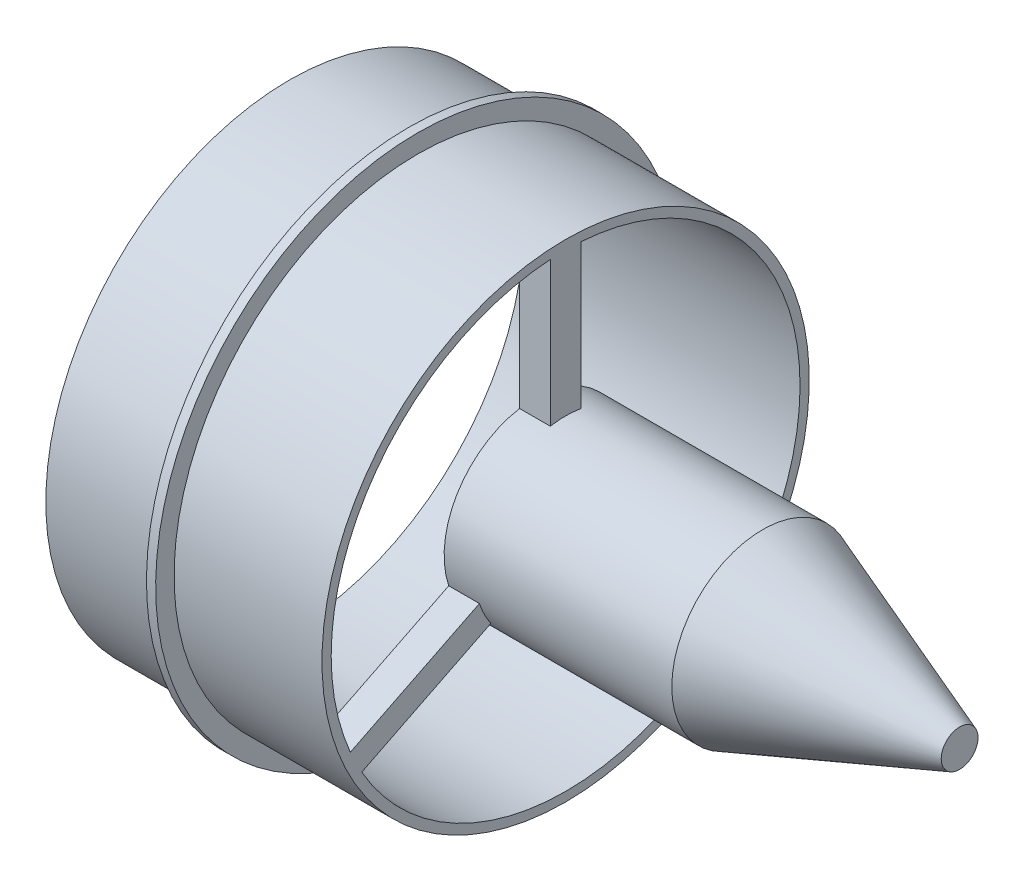
ISO-10303-21;
HEADER;
FILE_DESCRIPTION(('STEP AP214'),'2;1');
FILE_NAME('part.step','',(''),(''),'','','');
FILE_SCHEMA(('AUTOMOTIVE_DESIGN { 1 0 10303 214 1 1 1 1 }'));
ENDSEC;
DATA;
#1=APPLICATION_CONTEXT('core data for automotive mechanical design processes');
#2=APPLICATION_PROTOCOL_DEFINITION('international standard','automotive_design',2000,#1);
#3=PRODUCT_CONTEXT('',#1,'mechanical');
#4=PRODUCT('Part','Part','',(#3));
#5=PRODUCT_RELATED_PRODUCT_CATEGORY('part','',(#4));
#6=PRODUCT_DEFINITION_FORMATION('','',#4);
#7=PRODUCT_DEFINITION_CONTEXT('part definition',#1,'design');
#8=PRODUCT_DEFINITION('design','',#6,#7);
#9=PRODUCT_DEFINITION_SHAPE('','',#8);
#10=(LENGTH_UNIT() NAMED_UNIT(*) SI_UNIT(.MILLI.,.METRE.));
#11=(NAMED_UNIT(*) PLANE_ANGLE_UNIT() SI_UNIT($,.RADIAN.));
#12=(NAMED_UNIT(*) SI_UNIT($,.STERADIAN.) SOLID_ANGLE_UNIT());
#13=UNCERTAINTY_MEASURE_WITH_UNIT(LENGTH_MEASURE(1.E-05),#10,'distance_accuracy_value','');
#14=(GEOMETRIC_REPRESENTATION_CONTEXT(3) GLOBAL_UNCERTAINTY_ASSIGNED_CONTEXT((#13)) GLOBAL_UNIT_ASSIGNED_CONTEXT((#10,
#11,#12)) REPRESENTATION_CONTEXT('',''));
#15=CARTESIAN_POINT('',(0.,0.,0.));
#16=DIRECTION('',(0.,0.,1.));
#17=DIRECTION('',(1.,0.,0.));
#18=AXIS2_PLACEMENT_3D('',#15,#16,#17);
#19=CARTESIAN_POINT('',(45.,0.,0.));
#20=DIRECTION('',(-1.,0.,0.));
#21=DIRECTION('',(0.,0.,1.));
#22=AXIS2_PLACEMENT_3D('',#19,#20,#21);
#23=CYLINDRICAL_SURFACE('',#22,39.7);
#24=CARTESIAN_POINT('',(0.,0.,0.));
#25=DIRECTION('',(1.,0.,0.));
#26=DIRECTION('',(0.,1.,0.));
#27=AXIS2_PLACEMENT_3D('',#24,#25,#26);
#28=CIRCLE('',#27,39.7);
#29=CARTESIAN_POINT('',(0.,39.7,0.));
#30=VERTEX_POINT('',#29);
#31=EDGE_CURVE('E10',#30,#30,#28,.T.);
#32=ORIENTED_EDGE('',*,*,#31,.T.);
#33=EDGE_LOOP('',(#32));
#34=FACE_BOUND('',#33,.T.);
#35=CARTESIAN_POINT('',(19.4,0.,0.));
#36=DIRECTION('',(1.,0.,0.));
#37=DIRECTION('',(0.,1.,0.));
#38=AXIS2_PLACEMENT_3D('',#35,#36,#37);
#39=CIRCLE('',#38,39.7);
#40=CARTESIAN_POINT('',(19.4,39.7,0.));
#41=VERTEX_POINT('',#40);
#42=EDGE_CURVE('E212',#41,#41,#39,.T.);
#43=ORIENTED_EDGE('',*,*,#42,.F.);
#44=EDGE_LOOP('',(#43));
#45=FACE_BOUND('',#44,.T.);
#46=ADVANCED_FACE('F16',(#34,#45),#23,.T.);
#47=CARTESIAN_POINT('',(45.,0.,0.));
#48=DIRECTION('',(-1.,0.,0.));
#49=DIRECTION('',(0.,0.,1.));
#50=AXIS2_PLACEMENT_3D('',#47,#48,#49);
#51=CYLINDRICAL_SURFACE('',#50,39.7);
#52=CARTESIAN_POINT('',(20.9,0.,0.));
#53=DIRECTION('',(1.,0.,0.));
#54=DIRECTION('',(0.,1.,0.));
#55=AXIS2_PLACEMENT_3D('',#52,#53,#54);
#56=CIRCLE('',#55,39.7);
#57=CARTESIAN_POINT('',(20.9,39.7,0.));
#58=VERTEX_POINT('',#57);
#59=EDGE_CURVE('E26',#58,#58,#56,.T.);
#60=ORIENTED_EDGE('',*,*,#59,.T.);
#61=EDGE_LOOP('',(#60));
#62=FACE_BOUND('',#61,.T.);
#63=CARTESIAN_POINT('',(45.,0.,0.));
#64=DIRECTION('',(1.,0.,0.));
#65=DIRECTION('',(0.,1.,0.));
#66=AXIS2_PLACEMENT_3D('',#63,#64,#65);
#67=CIRCLE('',#66,39.7);
#68=CARTESIAN_POINT('',(45.,39.7,0.));
#69=VERTEX_POINT('',#68);
#70=EDGE_CURVE('E246',#69,#69,#67,.T.);
#71=ORIENTED_EDGE('',*,*,#70,.F.);
#72=EDGE_LOOP('',(#71));
#73=FACE_BOUND('',#72,.T.);
#74=ADVANCED_FACE('F260',(#62,#73),#51,.T.);
#75=CARTESIAN_POINT('',(45.,0.,0.));
#76=DIRECTION('',(1.,0.,0.));
#77=DIRECTION('',(0.,0.,-1.));
#78=AXIS2_PLACEMENT_3D('',#75,#76,#77);
#79=PLANE('',#78);
#80=ORIENTED_EDGE('',*,*,#70,.T.);
#81=EDGE_LOOP('',(#80));
#82=FACE_BOUND('',#81,.T.);
#83=CARTESIAN_POINT('',(45.,0.,0.));
#84=DIRECTION('',(1.,0.,0.));
#85=DIRECTION('',(0.,1.,0.));
#86=AXIS2_PLACEMENT_3D('',#83,#84,#85);
#87=CIRCLE('',#86,14.8);
#88=CARTESIAN_POINT('',(45.,14.5873232637109,-2.5));
#89=VERTEX_POINT('',#88);
#90=CARTESIAN_POINT('',(45.,14.5873232637109,2.5));
#91=VERTEX_POINT('',#90);
#92=EDGE_CURVE('E35',#89,#91,#87,.T.);
#93=ORIENTED_EDGE('',*,*,#92,.F.);
#94=DIRECTION('',(0.,1.,0.));
#95=VECTOR('',#94,1.);
#96=CARTESIAN_POINT('',(45.,14.5873232637109,-2.5));
#97=LINE('',#96,#95);
#98=CARTESIAN_POINT('',(45.,38.1181059340571,-2.5));
#99=VERTEX_POINT('',#98);
#100=EDGE_CURVE('E240',#89,#99,#97,.T.);
#101=ORIENTED_EDGE('',*,*,#100,.T.);
#102=CARTESIAN_POINT('',(45.,0.,0.));
#103=DIRECTION('',(-1.,0.,0.));
#104=DIRECTION('',(0.,0.,1.));
#105=AXIS2_PLACEMENT_3D('',#102,#103,#104);
#106=CIRCLE('',#105,38.2);
#107=CARTESIAN_POINT('',(45.,-15.1312278528921,-35.0754321949689));
#108=VERTEX_POINT('',#107);
#109=EDGE_CURVE('E245',#99,#108,#106,.T.);
#110=ORIENTED_EDGE('',*,*,#109,.T.);
#111=DIRECTION('',(0.,0.445659530203826,0.895202537495569));
#112=VECTOR('',#111,1.);
#113=CARTESIAN_POINT('',(45.,-15.1312278528921,-35.0754321949689));
#114=LINE('',#113,#112);
#115=CARTESIAN_POINT('',(45.,-4.66234567366432,-14.0464419985726));
#116=VERTEX_POINT('',#115);
#117=EDGE_CURVE('E219',#108,#116,#114,.T.);
#118=ORIENTED_EDGE('',*,*,#117,.T.);
#119=CARTESIAN_POINT('',(45.,0.,0.));
#120=DIRECTION('',(1.,0.,0.));
#121=DIRECTION('',(0.,1.,0.));
#122=AXIS2_PLACEMENT_3D('',#119,#120,#121);
#123=CIRCLE('',#122,14.8);
#124=CARTESIAN_POINT('',(45.,-8.39746558109926,-12.1869837045207));
#125=VERTEX_POINT('',#124);
#126=EDGE_CURVE('E164',#125,#116,#123,.T.);
#127=ORIENTED_EDGE('',*,*,#126,.F.);
#128=DIRECTION('',(0.,-0.445659530203826,-0.895202537495569));
#129=VECTOR('',#128,1.);
#130=CARTESIAN_POINT('',(45.,-8.39746558109925,-12.1869837045207));
#131=LINE('',#130,#129);
#132=CARTESIAN_POINT('',(45.,-18.866347760327,-33.215973900917));
#133=VERTEX_POINT('',#132);
#134=EDGE_CURVE('E221',#125,#133,#131,.T.);
#135=ORIENTED_EDGE('',*,*,#134,.T.);
#136=CARTESIAN_POINT('',(45.,0.,0.));
#137=DIRECTION('',(-1.,0.,0.));
#138=DIRECTION('',(0.,0.,1.));
#139=AXIS2_PLACEMENT_3D('',#136,#137,#138);
#140=CIRCLE('',#139,38.2);
#141=CARTESIAN_POINT('',(45.,-18.866347760327,33.2159739009171));
#142=VERTEX_POINT('',#141);
#143=EDGE_CURVE('E223',#133,#142,#140,.T.);
#144=ORIENTED_EDGE('',*,*,#143,.T.);
#145=DIRECTION('',(0.,0.445659530203826,-0.895202537495569));
#146=VECTOR('',#145,1.);
#147=CARTESIAN_POINT('',(45.,-18.866347760327,33.2159739009171));
#148=LINE('',#147,#146);
#149=CARTESIAN_POINT('',(45.,-8.39746558109925,12.1869837045207));
#150=VERTEX_POINT('',#149);
#151=EDGE_CURVE('E175',#142,#150,#148,.T.);
#152=ORIENTED_EDGE('',*,*,#151,.T.);
#153=CARTESIAN_POINT('',(45.,0.,0.));
#154=DIRECTION('',(1.,0.,0.));
#155=DIRECTION('',(0.,1.,0.));
#156=AXIS2_PLACEMENT_3D('',#153,#154,#155);
#157=CIRCLE('',#156,14.8);
#158=CARTESIAN_POINT('',(45.,-4.66234567366432,14.0464419985726));
#159=VERTEX_POINT('',#158);
#160=EDGE_CURVE('E115',#159,#150,#157,.T.);
#161=ORIENTED_EDGE('',*,*,#160,.F.);
#162=DIRECTION('',(0.,-0.445659530203826,0.895202537495569));
#163=VECTOR('',#162,1.);
#164=CARTESIAN_POINT('',(45.,-4.66234567366432,14.0464419985726));
#165=LINE('',#164,#163);
#166=CARTESIAN_POINT('',(45.,-15.1312278528921,35.0754321949689));
#167=VERTEX_POINT('',#166);
#168=EDGE_CURVE('E177',#159,#167,#165,.T.);
#169=ORIENTED_EDGE('',*,*,#168,.T.);
#170=CARTESIAN_POINT('',(45.,0.,0.));
#171=DIRECTION('',(-1.,0.,0.));
#172=DIRECTION('',(0.,0.,1.));
#173=AXIS2_PLACEMENT_3D('',#170,#171,#172);
#174=CIRCLE('',#173,38.2);
#175=CARTESIAN_POINT('',(45.,38.1181059340571,2.5));
#176=VERTEX_POINT('',#175);
#177=EDGE_CURVE('E180',#167,#176,#174,.T.);
#178=ORIENTED_EDGE('',*,*,#177,.T.);
#179=DIRECTION('',(0.,-1.,0.));
#180=VECTOR('',#179,1.);
#181=CARTESIAN_POINT('',(45.,38.1181059340571,2.5));
#182=LINE('',#181,#180);
#183=EDGE_CURVE('E183',#176,#91,#182,.T.);
#184=ORIENTED_EDGE('',*,*,#183,.T.);
#185=EDGE_LOOP('',(#93,#101,#110,#118,#127,#135,#144,#152,#161,#169,#178,#184));
#186=FACE_BOUND('',#185,.T.);
#187=ADVANCED_FACE('F225',(#82,#186),#79,.T.);
#188=CARTESIAN_POINT('',(0.,0.,0.));
#189=DIRECTION('',(1.,0.,0.));
#190=DIRECTION('',(0.,0.,-1.));
#191=AXIS2_PLACEMENT_3D('',#188,#189,#190);
#192=PLANE('',#191);
#193=ORIENTED_EDGE('',*,*,#31,.F.);
#194=EDGE_LOOP('',(#193));
#195=FACE_BOUND('',#194,.T.);
#196=CARTESIAN_POINT('',(0.,0.,0.));
#197=DIRECTION('',(-1.,0.,0.));
#198=DIRECTION('',(0.,0.,1.));
#199=AXIS2_PLACEMENT_3D('',#196,#197,#198);
#200=CIRCLE('',#199,38.2);
#201=CARTESIAN_POINT('',(0.,0.,38.2));
#202=VERTEX_POINT('',#201);
#203=EDGE_CURVE('E186',#202,#202,#200,.T.);
#204=ORIENTED_EDGE('',*,*,#203,.F.);
#205=EDGE_LOOP('',(#204));
#206=FACE_BOUND('',#205,.T.);
#207=ADVANCED_FACE('F311',(#195,#206),#192,.F.);
#208=CARTESIAN_POINT('',(45.,0.,0.));
#209=DIRECTION('',(-1.,0.,0.));
#210=DIRECTION('',(0.,0.,1.));
#211=AXIS2_PLACEMENT_3D('',#208,#209,#210);
#212=CYLINDRICAL_SURFACE('',#211,38.2);
#213=CARTESIAN_POINT('',(40.,0.,0.));
#214=DIRECTION('',(1.,0.,0.));
#215=DIRECTION('',(0.,1.,0.));
#216=AXIS2_PLACEMENT_3D('',#213,#214,#215);
#217=CIRCLE('',#216,38.2);
#218=CARTESIAN_POINT('',(40.,-15.1312278528921,35.0754321949689));
#219=VERTEX_POINT('',#218);
#220=CARTESIAN_POINT('',(40.,-18.866347760327,33.2159739009171));
#221=VERTEX_POINT('',#220);
#222=EDGE_CURVE('E185',#219,#221,#217,.T.);
#223=ORIENTED_EDGE('',*,*,#222,.T.);
#224=DIRECTION('',(1.,0.,0.));
#225=VECTOR('',#224,1.);
#226=CARTESIAN_POINT('',(40.,-18.866347760327,33.2159739009171));
#227=LINE('',#226,#225);
#228=EDGE_CURVE('E133',#221,#142,#227,.T.);
#229=ORIENTED_EDGE('',*,*,#228,.T.);
#230=ORIENTED_EDGE('',*,*,#143,.F.);
#231=DIRECTION('',(1.,0.,0.));
#232=VECTOR('',#231,1.);
#233=CARTESIAN_POINT('',(40.,-18.866347760327,-33.215973900917));
#234=LINE('',#233,#232);
#235=CARTESIAN_POINT('',(40.,-18.866347760327,-33.215973900917));
#236=VERTEX_POINT('',#235);
#237=EDGE_CURVE('E194',#236,#133,#234,.T.);
#238=ORIENTED_EDGE('',*,*,#237,.F.);
#239=CARTESIAN_POINT('',(40.,0.,0.));
#240=DIRECTION('',(1.,0.,0.));
#241=DIRECTION('',(0.,1.,0.));
#242=AXIS2_PLACEMENT_3D('',#239,#240,#241);
#243=CIRCLE('',#242,38.2);
#244=CARTESIAN_POINT('',(40.,-15.1312278528921,-35.0754321949689));
#245=VERTEX_POINT('',#244);
#246=EDGE_CURVE('E193',#236,#245,#243,.T.);
#247=ORIENTED_EDGE('',*,*,#246,.T.);
#248=DIRECTION('',(1.,0.,0.));
#249=VECTOR('',#248,1.);
#250=CARTESIAN_POINT('',(40.,-15.1312278528921,-35.0754321949689));
#251=LINE('',#250,#249);
#252=EDGE_CURVE('E200',#245,#108,#251,.T.);
#253=ORIENTED_EDGE('',*,*,#252,.T.);
#254=ORIENTED_EDGE('',*,*,#109,.F.);
#255=DIRECTION('',(1.,0.,0.));
#256=VECTOR('',#255,1.);
#257=CARTESIAN_POINT('',(40.,38.1181059340571,-2.5));
#258=LINE('',#257,#256);
#259=CARTESIAN_POINT('',(40.,38.1181059340571,-2.5));
#260=VERTEX_POINT('',#259);
#261=EDGE_CURVE('E147',#260,#99,#258,.T.);
#262=ORIENTED_EDGE('',*,*,#261,.F.);
#263=CARTESIAN_POINT('',(40.,0.,0.));
#264=DIRECTION('',(1.,0.,0.));
#265=DIRECTION('',(0.,1.,0.));
#266=AXIS2_PLACEMENT_3D('',#263,#264,#265);
#267=CIRCLE('',#266,38.2);
#268=CARTESIAN_POINT('',(40.,38.1181059340571,2.5));
#269=VERTEX_POINT('',#268);
#270=EDGE_CURVE('E202',#260,#269,#267,.T.);
#271=ORIENTED_EDGE('',*,*,#270,.T.);
#272=DIRECTION('',(1.,0.,0.));
#273=VECTOR('',#272,1.);
#274=CARTESIAN_POINT('',(40.,38.1181059340571,2.5));
#275=LINE('',#274,#273);
#276=EDGE_CURVE('E189',#269,#176,#275,.T.);
#277=ORIENTED_EDGE('',*,*,#276,.T.);
#278=ORIENTED_EDGE('',*,*,#177,.F.);
#279=DIRECTION('',(1.,0.,0.));
#280=VECTOR('',#279,1.);
#281=CARTESIAN_POINT('',(40.,-15.1312278528921,35.0754321949689));
#282=LINE('',#281,#280);
#283=EDGE_CURVE('E140',#219,#167,#282,.T.);
#284=ORIENTED_EDGE('',*,*,#283,.F.);
#285=EDGE_LOOP('',(#223,#229,#230,#238,#247,#253,#254,#262,#271,#277,#278,#284));
#286=FACE_BOUND('',#285,.T.);
#287=ORIENTED_EDGE('',*,*,#203,.T.);
#288=EDGE_LOOP('',(#287));
#289=FACE_BOUND('',#288,.T.);
#290=ADVANCED_FACE('F229',(#286,#289),#212,.F.);
#291=CARTESIAN_POINT('',(20.9,0.,0.));
#292=DIRECTION('',(1.,0.,0.));
#293=DIRECTION('',(0.,0.,-1.));
#294=AXIS2_PLACEMENT_3D('',#291,#292,#293);
#295=PLANE('',#294);
#296=CARTESIAN_POINT('',(20.9,0.,0.));
#297=DIRECTION('',(1.,0.,0.));
#298=DIRECTION('',(0.,1.,0.));
#299=AXIS2_PLACEMENT_3D('',#296,#297,#298);
#300=CIRCLE('',#299,42.7);
#301=CARTESIAN_POINT('',(20.9,42.7,0.));
#302=VERTEX_POINT('',#301);
#303=EDGE_CURVE('E190',#302,#302,#300,.T.);
#304=ORIENTED_EDGE('',*,*,#303,.T.);
#305=EDGE_LOOP('',(#304));
#306=FACE_BOUND('',#305,.T.);
#307=ORIENTED_EDGE('',*,*,#59,.F.);
#308=EDGE_LOOP('',(#307));
#309=FACE_BOUND('',#308,.T.);
#310=ADVANCED_FACE('F310',(#306,#309),#295,.T.);
#311=CARTESIAN_POINT('',(19.4,0.,0.));
#312=DIRECTION('',(1.,0.,0.));
#313=DIRECTION('',(0.,0.,-1.));
#314=AXIS2_PLACEMENT_3D('',#311,#312,#313);
#315=PLANE('',#314);
#316=CARTESIAN_POINT('',(19.4,0.,0.));
#317=DIRECTION('',(1.,0.,0.));
#318=DIRECTION('',(0.,1.,0.));
#319=AXIS2_PLACEMENT_3D('',#316,#317,#318);
#320=CIRCLE('',#319,42.7);
#321=CARTESIAN_POINT('',(19.4,42.7,0.));
#322=VERTEX_POINT('',#321);
#323=EDGE_CURVE('E213',#322,#322,#320,.T.);
#324=ORIENTED_EDGE('',*,*,#323,.F.);
#325=EDGE_LOOP('',(#324));
#326=FACE_BOUND('',#325,.T.);
#327=ORIENTED_EDGE('',*,*,#42,.T.);
#328=EDGE_LOOP('',(#327));
#329=FACE_BOUND('',#328,.T.);
#330=ADVANCED_FACE('F257',(#326,#329),#315,.F.);
#331=CARTESIAN_POINT('',(20.9,0.,0.));
#332=DIRECTION('',(-1.,0.,0.));
#333=DIRECTION('',(0.,0.,1.));
#334=AXIS2_PLACEMENT_3D('',#331,#332,#333);
#335=CYLINDRICAL_SURFACE('',#334,42.7);
#336=ORIENTED_EDGE('',*,*,#303,.F.);
#337=EDGE_LOOP('',(#336));
#338=FACE_BOUND('',#337,.T.);
#339=ORIENTED_EDGE('',*,*,#323,.T.);
#340=EDGE_LOOP('',(#339));
#341=FACE_BOUND('',#340,.T.);
#342=ADVANCED_FACE('F270',(#338,#341),#335,.T.);
#343=CARTESIAN_POINT('',(40.,-8.39746558109925,-12.1869837045207));
#344=DIRECTION('',(0.,-0.895202537495569,0.445659530203826));
#345=DIRECTION('',(0.,-0.445659530203826,-0.895202537495569));
#346=AXIS2_PLACEMENT_3D('',#343,#344,#345);
#347=PLANE('',#346);
#348=ORIENTED_EDGE('',*,*,#134,.F.);
#349=DIRECTION('',(1.,0.,0.));
#350=VECTOR('',#349,1.);
#351=CARTESIAN_POINT('',(40.,-8.39746558109926,-12.1869837045207));
#352=LINE('',#351,#350);
#353=CARTESIAN_POINT('',(40.,-8.39746558109926,-12.1869837045207));
#354=VERTEX_POINT('',#353);
#355=EDGE_CURVE('E197',#354,#125,#352,.T.);
#356=ORIENTED_EDGE('',*,*,#355,.F.);
#357=DIRECTION('',(0.,-0.445659530203826,-0.895202537495569));
#358=VECTOR('',#357,1.);
#359=CARTESIAN_POINT('',(40.,-8.39746558109925,-12.1869837045207));
#360=LINE('',#359,#358);
#361=EDGE_CURVE('E129',#354,#236,#360,.T.);
#362=ORIENTED_EDGE('',*,*,#361,.T.);
#363=ORIENTED_EDGE('',*,*,#237,.T.);
#364=EDGE_LOOP('',(#348,#356,#362,#363));
#365=FACE_BOUND('',#364,.T.);
#366=ADVANCED_FACE('F243',(#365),#347,.T.);
#367=CARTESIAN_POINT('',(40.,0.,0.));
#368=DIRECTION('',(1.,0.,0.));
#369=DIRECTION('',(0.,1.,0.));
#370=AXIS2_PLACEMENT_3D('',#367,#368,#369);
#371=CYLINDRICAL_SURFACE('',#370,14.8);
#372=ORIENTED_EDGE('',*,*,#355,.T.);
#373=ORIENTED_EDGE('',*,*,#126,.T.);
#374=DIRECTION('',(1.,0.,0.));
#375=VECTOR('',#374,1.);
#376=CARTESIAN_POINT('',(40.,-4.66234567366432,-14.0464419985726));
#377=LINE('',#376,#375);
#378=CARTESIAN_POINT('',(40.,-4.66234567366432,-14.0464419985726));
#379=VERTEX_POINT('',#378);
#380=EDGE_CURVE('E150',#379,#116,#377,.T.);
#381=ORIENTED_EDGE('',*,*,#380,.F.);
#382=CARTESIAN_POINT('',(40.,0.,0.));
#383=DIRECTION('',(1.,0.,0.));
#384=DIRECTION('',(0.,1.,0.));
#385=AXIS2_PLACEMENT_3D('',#382,#383,#384);
#386=CIRCLE('',#385,14.8);
#387=CARTESIAN_POINT('',(40.,14.5873232637109,-2.5));
#388=VERTEX_POINT('',#387);
#389=EDGE_CURVE('E161',#379,#388,#386,.T.);
#390=ORIENTED_EDGE('',*,*,#389,.T.);
#391=DIRECTION('',(1.,0.,0.));
#392=VECTOR('',#391,1.);
#393=CARTESIAN_POINT('',(40.,14.5873232637109,-2.5));
#394=LINE('',#393,#392);
#395=EDGE_CURVE('E165',#388,#89,#394,.T.);
#396=ORIENTED_EDGE('',*,*,#395,.T.);
#397=ORIENTED_EDGE('',*,*,#92,.T.);
#398=DIRECTION('',(1.,0.,0.));
#399=VECTOR('',#398,1.);
#400=CARTESIAN_POINT('',(40.,14.5873232637109,2.5));
#401=LINE('',#400,#399);
#402=CARTESIAN_POINT('',(40.,14.5873232637109,2.5));
#403=VERTEX_POINT('',#402);
#404=EDGE_CURVE('E144',#403,#91,#401,.T.);
#405=ORIENTED_EDGE('',*,*,#404,.F.);
#406=CARTESIAN_POINT('',(40.,0.,0.));
#407=DIRECTION('',(1.,0.,0.));
#408=DIRECTION('',(0.,1.,0.));
#409=AXIS2_PLACEMENT_3D('',#406,#407,#408);
#410=CIRCLE('',#409,14.8);
#411=CARTESIAN_POINT('',(40.,-4.66234567366432,14.0464419985726));
#412=VERTEX_POINT('',#411);
#413=EDGE_CURVE('E170',#403,#412,#410,.T.);
#414=ORIENTED_EDGE('',*,*,#413,.T.);
#415=DIRECTION('',(1.,0.,0.));
#416=VECTOR('',#415,1.);
#417=CARTESIAN_POINT('',(40.,-4.66234567366432,14.0464419985726));
#418=LINE('',#417,#416);
#419=EDGE_CURVE('E104',#412,#159,#418,.T.);
#420=ORIENTED_EDGE('',*,*,#419,.T.);
#421=ORIENTED_EDGE('',*,*,#160,.T.);
#422=DIRECTION('',(1.,0.,0.));
#423=VECTOR('',#422,1.);
#424=CARTESIAN_POINT('',(40.,-8.39746558109925,12.1869837045207));
#425=LINE('',#424,#423);
#426=CARTESIAN_POINT('',(40.,-8.39746558109925,12.1869837045207));
#427=VERTEX_POINT('',#426);
#428=EDGE_CURVE('E110',#427,#150,#425,.T.);
#429=ORIENTED_EDGE('',*,*,#428,.F.);
#430=CARTESIAN_POINT('',(40.,0.,0.));
#431=DIRECTION('',(1.,0.,0.));
#432=DIRECTION('',(0.,1.,0.));
#433=AXIS2_PLACEMENT_3D('',#430,#431,#432);
#434=CIRCLE('',#433,14.8);
#435=EDGE_CURVE('E114',#427,#354,#434,.T.);
#436=ORIENTED_EDGE('',*,*,#435,.T.);
#437=EDGE_LOOP('',(#372,#373,#381,#390,#396,#397,#405,#414,#420,#421,#429,#436));
#438=FACE_BOUND('',#437,.T.);
#439=CARTESIAN_POINT('',(77.1,0.,0.));
#440=DIRECTION('',(1.,0.,0.));
#441=DIRECTION('',(0.,0.,1.));
#442=AXIS2_PLACEMENT_3D('',#439,#440,#441);
#443=CIRCLE('',#442,14.8);
#444=CARTESIAN_POINT('',(77.1,0.,14.8));
#445=VERTEX_POINT('',#444);
#446=EDGE_CURVE('E138',#445,#445,#443,.T.);
#447=ORIENTED_EDGE('',*,*,#446,.F.);
#448=EDGE_LOOP('',(#447));
#449=FACE_BOUND('',#448,.T.);
#450=ADVANCED_FACE('F18',(#438,#449),#371,.T.);
#451=CARTESIAN_POINT('',(40.,-8.39746558109925,12.1869837045207));
#452=DIRECTION('',(0.,-0.895202537495569,-0.445659530203826));
#453=DIRECTION('',(0.,0.445659530203826,-0.895202537495569));
#454=AXIS2_PLACEMENT_3D('',#451,#452,#453);
#455=PLANE('',#454);
#456=ORIENTED_EDGE('',*,*,#151,.F.);
#457=ORIENTED_EDGE('',*,*,#228,.F.);
#458=DIRECTION('',(0.,0.445659530203826,-0.895202537495569));
#459=VECTOR('',#458,1.);
#460=CARTESIAN_POINT('',(40.,-18.866347760327,33.2159739009171));
#461=LINE('',#460,#459);
#462=EDGE_CURVE('E119',#221,#427,#461,.T.);
#463=ORIENTED_EDGE('',*,*,#462,.T.);
#464=ORIENTED_EDGE('',*,*,#428,.T.);
#465=EDGE_LOOP('',(#456,#457,#463,#464));
#466=FACE_BOUND('',#465,.T.);
#467=ADVANCED_FACE('F131',(#466),#455,.T.);
#468=CARTESIAN_POINT('',(40.,-4.66234567366432,14.0464419985726));
#469=DIRECTION('',(0.,0.895202537495569,0.445659530203826));
#470=DIRECTION('',(0.,-0.445659530203826,0.895202537495569));
#471=AXIS2_PLACEMENT_3D('',#468,#469,#470);
#472=PLANE('',#471);
#473=ORIENTED_EDGE('',*,*,#168,.F.);
#474=ORIENTED_EDGE('',*,*,#419,.F.);
#475=DIRECTION('',(0.,-0.445659530203826,0.895202537495569));
#476=VECTOR('',#475,1.);
#477=CARTESIAN_POINT('',(40.,-4.66234567366432,14.0464419985726));
#478=LINE('',#477,#476);
#479=EDGE_CURVE('E120',#412,#219,#478,.T.);
#480=ORIENTED_EDGE('',*,*,#479,.T.);
#481=ORIENTED_EDGE('',*,*,#283,.T.);
#482=EDGE_LOOP('',(#473,#474,#480,#481));
#483=FACE_BOUND('',#482,.T.);
#484=ADVANCED_FACE('F226',(#483),#472,.T.);
#485=CARTESIAN_POINT('',(40.,14.5873232637109,2.5));
#486=DIRECTION('',(0.,0.,1.));
#487=DIRECTION('',(1.,0.,0.));
#488=AXIS2_PLACEMENT_3D('',#485,#486,#487);
#489=PLANE('',#488);
#490=ORIENTED_EDGE('',*,*,#183,.F.);
#491=ORIENTED_EDGE('',*,*,#276,.F.);
#492=DIRECTION('',(0.,-1.,0.));
#493=VECTOR('',#492,1.);
#494=CARTESIAN_POINT('',(40.,38.1181059340571,2.5));
#495=LINE('',#494,#493);
#496=EDGE_CURVE('E141',#269,#403,#495,.T.);
#497=ORIENTED_EDGE('',*,*,#496,.T.);
#498=ORIENTED_EDGE('',*,*,#404,.T.);
#499=EDGE_LOOP('',(#490,#491,#497,#498));
#500=FACE_BOUND('',#499,.T.);
#501=ADVANCED_FACE('F235',(#500),#489,.T.);
#502=CARTESIAN_POINT('',(40.,14.5873232637109,-2.5));
#503=DIRECTION('',(0.,0.,-1.));
#504=DIRECTION('',(-1.,0.,0.));
#505=AXIS2_PLACEMENT_3D('',#502,#503,#504);
#506=PLANE('',#505);
#507=ORIENTED_EDGE('',*,*,#100,.F.);
#508=ORIENTED_EDGE('',*,*,#395,.F.);
#509=DIRECTION('',(0.,1.,0.));
#510=VECTOR('',#509,1.);
#511=CARTESIAN_POINT('',(40.,14.5873232637109,-2.5));
#512=LINE('',#511,#510);
#513=EDGE_CURVE('E145',#388,#260,#512,.T.);
#514=ORIENTED_EDGE('',*,*,#513,.T.);
#515=ORIENTED_EDGE('',*,*,#261,.T.);
#516=EDGE_LOOP('',(#507,#508,#514,#515));
#517=FACE_BOUND('',#516,.T.);
#518=ADVANCED_FACE('F239',(#517),#506,.T.);
#519=CARTESIAN_POINT('',(40.,-4.66234567366432,-14.0464419985726));
#520=DIRECTION('',(0.,0.895202537495569,-0.445659530203826));
#521=DIRECTION('',(0.,0.445659530203826,0.895202537495569));
#522=AXIS2_PLACEMENT_3D('',#519,#520,#521);
#523=PLANE('',#522);
#524=ORIENTED_EDGE('',*,*,#117,.F.);
#525=ORIENTED_EDGE('',*,*,#252,.F.);
#526=DIRECTION('',(0.,0.445659530203826,0.895202537495569));
#527=VECTOR('',#526,1.);
#528=CARTESIAN_POINT('',(40.,-15.1312278528921,-35.0754321949689));
#529=LINE('',#528,#527);
#530=EDGE_CURVE('E148',#245,#379,#529,.T.);
#531=ORIENTED_EDGE('',*,*,#530,.T.);
#532=ORIENTED_EDGE('',*,*,#380,.T.);
#533=EDGE_LOOP('',(#524,#525,#531,#532));
#534=FACE_BOUND('',#533,.T.);
#535=ADVANCED_FACE('F305',(#534),#523,.T.);
#536=CARTESIAN_POINT('',(40.,0.,0.));
#537=DIRECTION('',(-1.,0.,0.));
#538=DIRECTION('',(0.,0.,1.));
#539=AXIS2_PLACEMENT_3D('',#536,#537,#538);
#540=PLANE('',#539);
#541=ORIENTED_EDGE('',*,*,#246,.F.);
#542=ORIENTED_EDGE('',*,*,#361,.F.);
#543=ORIENTED_EDGE('',*,*,#435,.F.);
#544=ORIENTED_EDGE('',*,*,#462,.F.);
#545=ORIENTED_EDGE('',*,*,#222,.F.);
#546=ORIENTED_EDGE('',*,*,#479,.F.);
#547=ORIENTED_EDGE('',*,*,#413,.F.);
#548=ORIENTED_EDGE('',*,*,#496,.F.);
#549=ORIENTED_EDGE('',*,*,#270,.F.);
#550=ORIENTED_EDGE('',*,*,#513,.F.);
#551=ORIENTED_EDGE('',*,*,#389,.F.);
#552=ORIENTED_EDGE('',*,*,#530,.F.);
#553=EDGE_LOOP('',(#541,#542,#543,#544,#545,#546,#547,#548,#549,#550,#551,#552));
#554=FACE_BOUND('',#553,.T.);
#555=ADVANCED_FACE('F126',(#554),#540,.T.);
#556=CARTESIAN_POINT('',(109.2,0.,0.));
#557=DIRECTION('',(1.,0.,0.));
#558=DIRECTION('',(0.,0.,-1.));
#559=AXIS2_PLACEMENT_3D('',#556,#557,#558);
#560=PLANE('',#559);
#561=CARTESIAN_POINT('',(109.2,0.,0.));
#562=DIRECTION('',(1.,0.,0.));
#563=DIRECTION('',(0.,1.,0.));
#564=AXIS2_PLACEMENT_3D('',#561,#562,#563);
#565=CIRCLE('',#564,3.);
#566=CARTESIAN_POINT('',(109.2,0.,3.));
#567=VERTEX_POINT('',#566);
#568=EDGE_CURVE('E20',#567,#567,#565,.T.);
#569=ORIENTED_EDGE('',*,*,#568,.T.);
#570=EDGE_LOOP('',(#569));
#571=FACE_BOUND('',#570,.T.);
#572=ADVANCED_FACE('F274',(#571),#560,.T.);
#573=CARTESIAN_POINT('',(109.2,0.,0.));
#574=DIRECTION('',(-1.,0.,0.));
#575=DIRECTION('',(0.,0.,1.));
#576=AXIS2_PLACEMENT_3D('',#573,#574,#575);
#577=CONICAL_SURFACE('',#576,3.,0.352268366291727);
#578=CARTESIAN_POINT('',(77.1,0.,14.8));
#579=CARTESIAN_POINT('',(77.434375,0.,14.6770833333333));
#580=CARTESIAN_POINT('',(77.76875,0.,14.5541666666667));
#581=CARTESIAN_POINT('',(78.4375,0.,14.3083333333333));
#582=CARTESIAN_POINT('',(78.771875,0.,14.1854166666667));
#583=CARTESIAN_POINT('',(79.440625,0.,13.9395833333333));
#584=CARTESIAN_POINT('',(79.775,0.,13.8166666666667));
#585=CARTESIAN_POINT('',(80.44375,0.,13.5708333333333));
#586=CARTESIAN_POINT('',(80.778125,0.,13.4479166666667));
#587=CARTESIAN_POINT('',(81.446875,0.,13.2020833333333));
#588=CARTESIAN_POINT('',(81.78125,0.,13.0791666666667));
#589=CARTESIAN_POINT('',(82.45,0.,12.8333333333333));
#590=CARTESIAN_POINT('',(82.784375,0.,12.7104166666667));
#591=CARTESIAN_POINT('',(83.453125,0.,12.4645833333333));
#592=CARTESIAN_POINT('',(83.7875,0.,12.3416666666667));
#593=CARTESIAN_POINT('',(84.45625,0.,12.0958333333333));
#594=CARTESIAN_POINT('',(84.790625,0.,11.9729166666667));
#595=CARTESIAN_POINT('',(85.459375,0.,11.7270833333333));
#596=CARTESIAN_POINT('',(85.79375,0.,11.6041666666667));
#597=CARTESIAN_POINT('',(86.4625,0.,11.3583333333333));
#598=CARTESIAN_POINT('',(86.796875,0.,11.2354166666667));
#599=CARTESIAN_POINT('',(87.465625,0.,10.9895833333333));
#600=CARTESIAN_POINT('',(87.8,0.,10.8666666666667));
#601=CARTESIAN_POINT('',(88.46875,0.,10.6208333333333));
#602=CARTESIAN_POINT('',(88.803125,0.,10.4979166666667));
#603=CARTESIAN_POINT('',(89.471875,0.,10.2520833333333));
#604=CARTESIAN_POINT('',(89.80625,0.,10.1291666666667));
#605=CARTESIAN_POINT('',(90.475,0.,9.88333333333333));
#606=CARTESIAN_POINT('',(90.809375,0.,9.76041666666667));
#607=CARTESIAN_POINT('',(91.478125,0.,9.51458333333334));
#608=CARTESIAN_POINT('',(91.8125,0.,9.39166666666667));
#609=CARTESIAN_POINT('',(92.48125,0.,9.14583333333333));
#610=CARTESIAN_POINT('',(92.815625,0.,9.02291666666667));
#611=CARTESIAN_POINT('',(93.484375,0.,8.77708333333334));
#612=CARTESIAN_POINT('',(93.81875,0.,8.65416666666667));
#613=CARTESIAN_POINT('',(94.4875,0.,8.40833333333333));
#614=CARTESIAN_POINT('',(94.821875,0.,8.28541666666667));
#615=CARTESIAN_POINT('',(95.490625,0.,8.03958333333334));
#616=CARTESIAN_POINT('',(95.825,0.,7.91666666666667));
#617=CARTESIAN_POINT('',(96.49375,0.,7.67083333333333));
#618=CARTESIAN_POINT('',(96.828125,0.,7.54791666666667));
#619=CARTESIAN_POINT('',(97.496875,0.,7.30208333333334));
#620=CARTESIAN_POINT('',(97.83125,0.,7.17916666666667));
#621=CARTESIAN_POINT('',(98.5,0.,6.93333333333333));
#622=CARTESIAN_POINT('',(98.834375,0.,6.81041666666667));
#623=CARTESIAN_POINT('',(99.503125,0.,6.56458333333334));
#624=CARTESIAN_POINT('',(99.8375,0.,6.44166666666667));
#625=CARTESIAN_POINT('',(100.50625,0.,6.19583333333333));
#626=CARTESIAN_POINT('',(100.840625,0.,6.07291666666667));
#627=CARTESIAN_POINT('',(101.509375,0.,5.82708333333334));
#628=CARTESIAN_POINT('',(101.84375,0.,5.70416666666667));
#629=CARTESIAN_POINT('',(102.5125,0.,5.45833333333334));
#630=CARTESIAN_POINT('',(102.846875,0.,5.33541666666667));
#631=CARTESIAN_POINT('',(103.515625,0.,5.08958333333334));
#632=CARTESIAN_POINT('',(103.85,0.,4.96666666666667));
#633=CARTESIAN_POINT('',(104.51875,0.,4.72083333333334));
#634=CARTESIAN_POINT('',(104.853125,0.,4.59791666666667));
#635=CARTESIAN_POINT('',(105.521875,0.,4.35208333333333));
#636=CARTESIAN_POINT('',(105.85625,0.,4.22916666666667));
#637=CARTESIAN_POINT('',(106.525,0.,3.98333333333334));
#638=CARTESIAN_POINT('',(106.859375,0.,3.86041666666667));
#639=CARTESIAN_POINT('',(107.528125,0.,3.61458333333334));
#640=CARTESIAN_POINT('',(107.8625,0.,3.49166666666667));
#641=CARTESIAN_POINT('',(108.53125,0.,3.24583333333334));
#642=CARTESIAN_POINT('',(108.865625,0.,3.12291666666667));
#643=CARTESIAN_POINT('',(109.2,0.,3.));
#644=B_SPLINE_CURVE_WITH_KNOTS('',3,(#578,#579,#580,#581,#582,#583,#584,#585,#586,#587,#588,
#589,#590,#591,#592,#593,#594,#595,#596,#597,#598,#599,#600,#601,#602,#603,#604,#605,#606,#607,
#608,#609,#610,#611,#612,#613,#614,#615,#616,#617,#618,#619,#620,#621,#622,#623,#624,#625,#626,
#627,#628,#629,#630,#631,#632,#633,#634,#635,#636,#637,#638,#639,#640,#641,#642,#643),
.UNSPECIFIED.,.F.,.F.,(4,2,2,2,2,2,2,2,2,2,2,2,2,2,2,2,2,2,2,2,2,2,2,2,2,2,2,2,2,2,2,2,4),(0.,
1.06875456870369,2.13750913740737,3.20626370611105,4.27501827481474,5.34377284351844,
6.41252741222211,7.48128198092579,8.55003654962949,9.61879111833318,10.6875456870369,
11.7563002557405,12.8250548244442,13.8938093931479,14.9625639618516,16.0313185305553,
17.100073099259,18.1688276679627,19.2375822366663,20.30633680537,21.3750913740737,
22.4438459427774,23.5126005114811,24.5813550801848,25.6501096488884,26.7188642175921,
27.7876187862958,28.8563733549995,29.9251279237032,30.9938824924069,32.0626370611106,
33.1313916298143,34.2001461985179),.UNSPECIFIED.);
#645=EDGE_CURVE('BSEAM272',#445,#567,#644,.T.);
#646=ORIENTED_EDGE('',*,*,#446,.T.);
#647=ORIENTED_EDGE('',*,*,#568,.F.);
#648=ORIENTED_EDGE('',*,*,#645,.T.);
#649=ORIENTED_EDGE('',*,*,#645,.F.);
#650=EDGE_LOOP('',(#646,#648,#647,#649));
#651=FACE_BOUND('',#650,.T.);
#652=ADVANCED_FACE('F272',(#651),#577,.T.);
#653=CLOSED_SHELL('',(#46,#74,#187,#207,#290,#310,#330,#342,#366,#450,#467,#484,#501,#518,#535,
#555,#572,#652));
#654=MANIFOLD_SOLID_BREP('B1',#653);
#655=ADVANCED_BREP_SHAPE_REPRESENTATION('',(#18,#654),#14);
#656=SHAPE_DEFINITION_REPRESENTATION(#9,#655);
ENDSEC;
END-ISO-10303-21;
